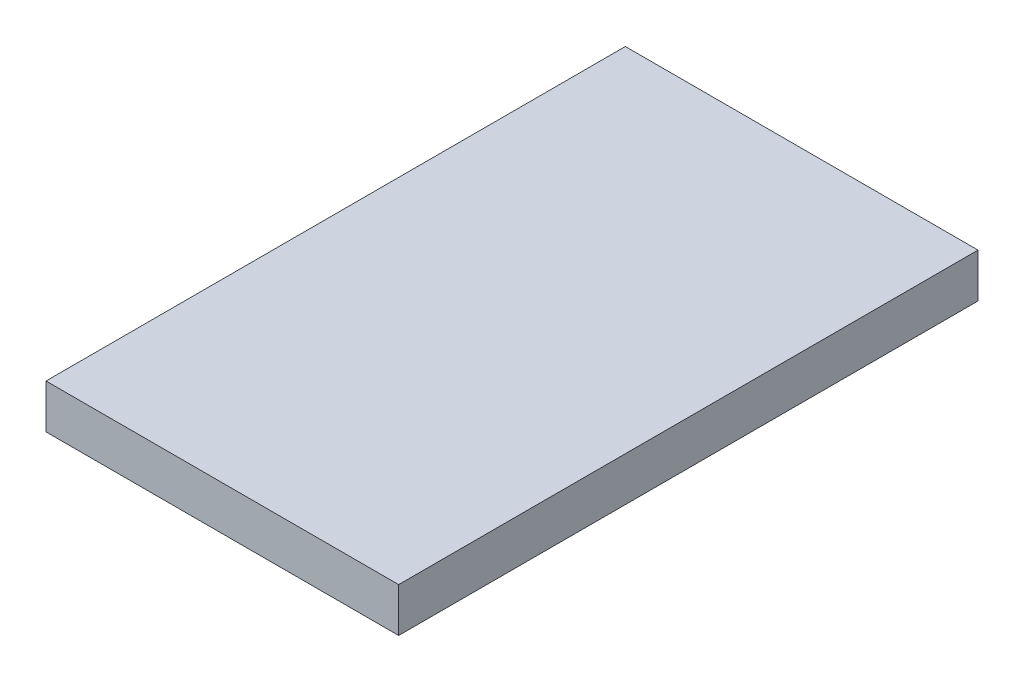
ISO-10303-21;
HEADER;
FILE_DESCRIPTION(('STEP AP214'),'2;1');
FILE_NAME('part.step','',(''),(''),'','','');
FILE_SCHEMA(('AUTOMOTIVE_DESIGN { 1 0 10303 214 1 1 1 1 }'));
ENDSEC;
DATA;
#1=APPLICATION_CONTEXT('core data for automotive mechanical design processes');
#2=APPLICATION_PROTOCOL_DEFINITION('international standard','automotive_design',2000,#1);
#3=PRODUCT_CONTEXT('',#1,'mechanical');
#4=PRODUCT('Part','Part','',(#3));
#5=PRODUCT_RELATED_PRODUCT_CATEGORY('part','',(#4));
#6=PRODUCT_DEFINITION_FORMATION('','',#4);
#7=PRODUCT_DEFINITION_CONTEXT('part definition',#1,'design');
#8=PRODUCT_DEFINITION('design','',#6,#7);
#9=PRODUCT_DEFINITION_SHAPE('','',#8);
#10=(LENGTH_UNIT() NAMED_UNIT(*) SI_UNIT(.MILLI.,.METRE.));
#11=(NAMED_UNIT(*) PLANE_ANGLE_UNIT() SI_UNIT($,.RADIAN.));
#12=(NAMED_UNIT(*) SI_UNIT($,.STERADIAN.) SOLID_ANGLE_UNIT());
#13=UNCERTAINTY_MEASURE_WITH_UNIT(LENGTH_MEASURE(1.E-05),#10,'distance_accuracy_value','');
#14=(GEOMETRIC_REPRESENTATION_CONTEXT(3) GLOBAL_UNCERTAINTY_ASSIGNED_CONTEXT((#13)) GLOBAL_UNIT_ASSIGNED_CONTEXT((#10,
#11,#12)) REPRESENTATION_CONTEXT('',''));
#15=CARTESIAN_POINT('',(0.,0.,0.));
#16=DIRECTION('',(0.,0.,1.));
#17=DIRECTION('',(1.,0.,0.));
#18=AXIS2_PLACEMENT_3D('',#15,#16,#17);
#19=CARTESIAN_POINT('',(28.,3.5,92.));
#20=DIRECTION('',(-1.,0.,0.));
#21=DIRECTION('',(0.,-1.,0.));
#22=AXIS2_PLACEMENT_3D('',#19,#20,#21);
#23=PLANE('',#22);
#24=DIRECTION('',(0.,1.,0.));
#25=VECTOR('',#24,1.);
#26=CARTESIAN_POINT('',(28.,3.5,0.));
#27=LINE('',#26,#25);
#28=CARTESIAN_POINT('',(28.,-3.5,0.));
#29=VERTEX_POINT('',#28);
#30=CARTESIAN_POINT('',(28.,3.5,0.));
#31=VERTEX_POINT('',#30);
#32=EDGE_CURVE('E99',#29,#31,#27,.T.);
#33=ORIENTED_EDGE('',*,*,#32,.T.);
#34=DIRECTION('',(0.,0.,-1.));
#35=VECTOR('',#34,1.);
#36=CARTESIAN_POINT('',(28.,3.5,92.));
#37=LINE('',#36,#35);
#38=CARTESIAN_POINT('',(28.,3.5,92.));
#39=VERTEX_POINT('',#38);
#40=EDGE_CURVE('E11',#39,#31,#37,.T.);
#41=ORIENTED_EDGE('',*,*,#40,.F.);
#42=DIRECTION('',(0.,1.,0.));
#43=VECTOR('',#42,1.);
#44=CARTESIAN_POINT('',(28.,3.5,92.));
#45=LINE('',#44,#43);
#46=CARTESIAN_POINT('',(28.,-3.5,92.));
#47=VERTEX_POINT('',#46);
#48=EDGE_CURVE('E87',#47,#39,#45,.T.);
#49=ORIENTED_EDGE('',*,*,#48,.F.);
#50=DIRECTION('',(0.,0.,-1.));
#51=VECTOR('',#50,1.);
#52=CARTESIAN_POINT('',(28.,-3.5,92.));
#53=LINE('',#52,#51);
#54=EDGE_CURVE('E95',#47,#29,#53,.T.);
#55=ORIENTED_EDGE('',*,*,#54,.T.);
#56=EDGE_LOOP('',(#33,#41,#49,#55));
#57=FACE_BOUND('',#56,.T.);
#58=ADVANCED_FACE('F36',(#57),#23,.F.);
#59=CARTESIAN_POINT('',(-28.,3.5,92.));
#60=DIRECTION('',(0.,-1.,0.));
#61=DIRECTION('',(0.,0.,-1.));
#62=AXIS2_PLACEMENT_3D('',#59,#60,#61);
#63=PLANE('',#62);
#64=DIRECTION('',(-1.,0.,0.));
#65=VECTOR('',#64,1.);
#66=CARTESIAN_POINT('',(-28.,3.5,0.));
#67=LINE('',#66,#65);
#68=CARTESIAN_POINT('',(-28.,3.5,0.));
#69=VERTEX_POINT('',#68);
#70=EDGE_CURVE('E91',#31,#69,#67,.T.);
#71=ORIENTED_EDGE('',*,*,#70,.T.);
#72=DIRECTION('',(0.,0.,-1.));
#73=VECTOR('',#72,1.);
#74=CARTESIAN_POINT('',(-28.,3.5,92.));
#75=LINE('',#74,#73);
#76=CARTESIAN_POINT('',(-28.,3.5,92.));
#77=VERTEX_POINT('',#76);
#78=EDGE_CURVE('E44',#77,#69,#75,.T.);
#79=ORIENTED_EDGE('',*,*,#78,.F.);
#80=DIRECTION('',(-1.,0.,0.));
#81=VECTOR('',#80,1.);
#82=CARTESIAN_POINT('',(-28.,3.5,92.));
#83=LINE('',#82,#81);
#84=EDGE_CURVE('E82',#39,#77,#83,.T.);
#85=ORIENTED_EDGE('',*,*,#84,.F.);
#86=ORIENTED_EDGE('',*,*,#40,.T.);
#87=EDGE_LOOP('',(#71,#79,#85,#86));
#88=FACE_BOUND('',#87,.T.);
#89=ADVANCED_FACE('F90',(#88),#63,.F.);
#90=CARTESIAN_POINT('',(-28.,3.5,92.));
#91=DIRECTION('',(1.,0.,0.));
#92=DIRECTION('',(0.,0.,-1.));
#93=AXIS2_PLACEMENT_3D('',#90,#91,#92);
#94=PLANE('',#93);
#95=DIRECTION('',(0.,-1.,0.));
#96=VECTOR('',#95,1.);
#97=CARTESIAN_POINT('',(-28.,3.5,0.));
#98=LINE('',#97,#96);
#99=CARTESIAN_POINT('',(-28.,-3.5,0.));
#100=VERTEX_POINT('',#99);
#101=EDGE_CURVE('E69',#69,#100,#98,.T.);
#102=ORIENTED_EDGE('',*,*,#101,.T.);
#103=DIRECTION('',(0.,0.,-1.));
#104=VECTOR('',#103,1.);
#105=CARTESIAN_POINT('',(-28.,-3.5,92.));
#106=LINE('',#105,#104);
#107=CARTESIAN_POINT('',(-28.,-3.5,92.));
#108=VERTEX_POINT('',#107);
#109=EDGE_CURVE('E92',#108,#100,#106,.T.);
#110=ORIENTED_EDGE('',*,*,#109,.F.);
#111=DIRECTION('',(0.,-1.,0.));
#112=VECTOR('',#111,1.);
#113=CARTESIAN_POINT('',(-28.,3.5,92.));
#114=LINE('',#113,#112);
#115=EDGE_CURVE('E85',#77,#108,#114,.T.);
#116=ORIENTED_EDGE('',*,*,#115,.F.);
#117=ORIENTED_EDGE('',*,*,#78,.T.);
#118=EDGE_LOOP('',(#102,#110,#116,#117));
#119=FACE_BOUND('',#118,.T.);
#120=ADVANCED_FACE('F93',(#119),#94,.F.);
#121=CARTESIAN_POINT('',(-28.,-3.5,92.));
#122=DIRECTION('',(0.,1.,0.));
#123=DIRECTION('',(0.,0.,1.));
#124=AXIS2_PLACEMENT_3D('',#121,#122,#123);
#125=PLANE('',#124);
#126=DIRECTION('',(1.,0.,0.));
#127=VECTOR('',#126,1.);
#128=CARTESIAN_POINT('',(-28.,-3.5,0.));
#129=LINE('',#128,#127);
#130=EDGE_CURVE('E75',#100,#29,#129,.T.);
#131=ORIENTED_EDGE('',*,*,#130,.T.);
#132=ORIENTED_EDGE('',*,*,#54,.F.);
#133=DIRECTION('',(1.,0.,0.));
#134=VECTOR('',#133,1.);
#135=CARTESIAN_POINT('',(-28.,-3.5,92.));
#136=LINE('',#135,#134);
#137=EDGE_CURVE('E52',#108,#47,#136,.T.);
#138=ORIENTED_EDGE('',*,*,#137,.F.);
#139=ORIENTED_EDGE('',*,*,#109,.T.);
#140=EDGE_LOOP('',(#131,#132,#138,#139));
#141=FACE_BOUND('',#140,.T.);
#142=ADVANCED_FACE('F106',(#141),#125,.F.);
#143=CARTESIAN_POINT('',(0.,0.,92.));
#144=DIRECTION('',(0.,0.,1.));
#145=DIRECTION('',(1.,0.,0.));
#146=AXIS2_PLACEMENT_3D('',#143,#144,#145);
#147=PLANE('',#146);
#148=ORIENTED_EDGE('',*,*,#48,.T.);
#149=ORIENTED_EDGE('',*,*,#84,.T.);
#150=ORIENTED_EDGE('',*,*,#115,.T.);
#151=ORIENTED_EDGE('',*,*,#137,.T.);
#152=EDGE_LOOP('',(#148,#149,#150,#151));
#153=FACE_BOUND('',#152,.T.);
#154=ADVANCED_FACE('F83',(#153),#147,.T.);
#155=CARTESIAN_POINT('',(0.,0.,0.));
#156=DIRECTION('',(0.,0.,1.));
#157=DIRECTION('',(1.,0.,0.));
#158=AXIS2_PLACEMENT_3D('',#155,#156,#157);
#159=PLANE('',#158);
#160=ORIENTED_EDGE('',*,*,#32,.F.);
#161=ORIENTED_EDGE('',*,*,#130,.F.);
#162=ORIENTED_EDGE('',*,*,#101,.F.);
#163=ORIENTED_EDGE('',*,*,#70,.F.);
#164=EDGE_LOOP('',(#160,#161,#162,#163));
#165=FACE_BOUND('',#164,.T.);
#166=ADVANCED_FACE('F109',(#165),#159,.F.);
#167=CLOSED_SHELL('',(#58,#89,#120,#142,#154,#166));
#168=MANIFOLD_SOLID_BREP('B2',#167);
#169=ADVANCED_BREP_SHAPE_REPRESENTATION('',(#18,#168),#14);
#170=SHAPE_DEFINITION_REPRESENTATION(#9,#169);
ENDSEC;
END-ISO-10303-21;
